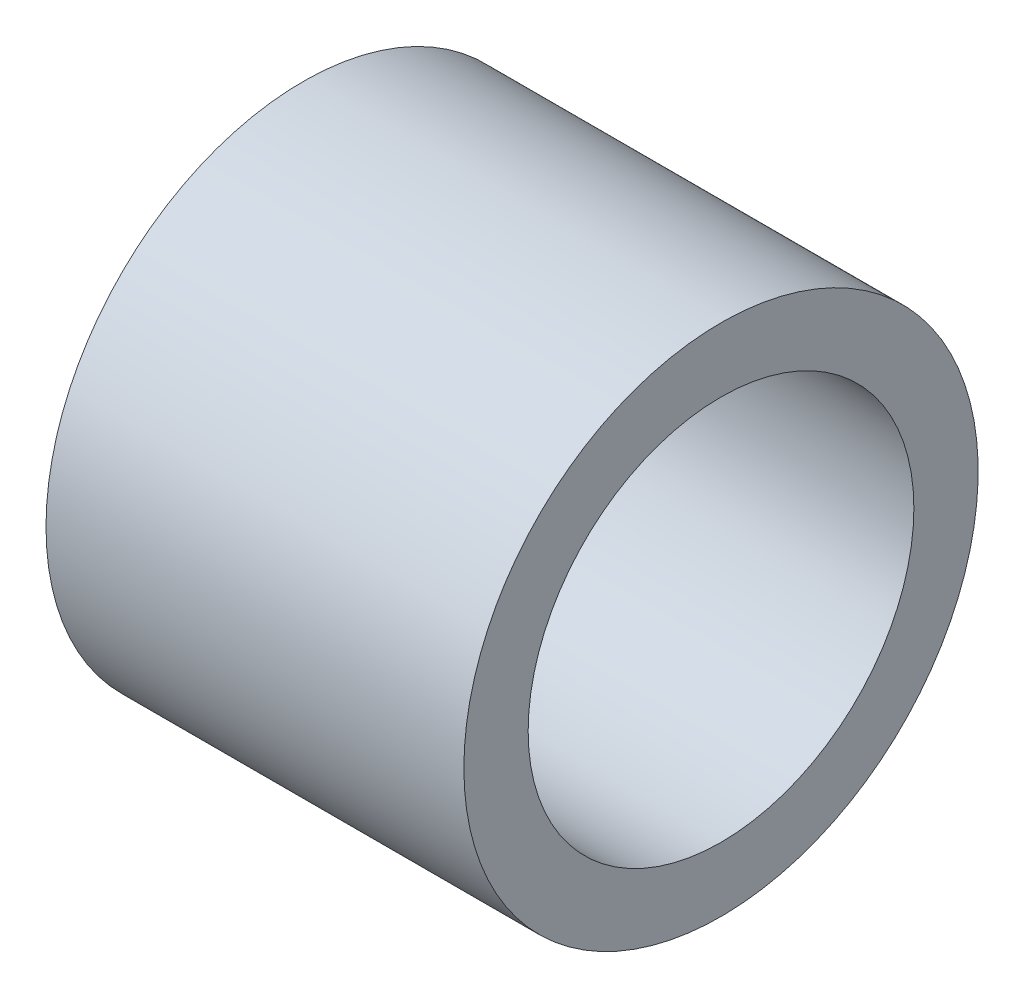
ISO-10303-21;
HEADER;
FILE_DESCRIPTION(('STEP AP214'),'2;1');
FILE_NAME('part.step','',(''),(''),'','','');
FILE_SCHEMA(('AUTOMOTIVE_DESIGN { 1 0 10303 214 1 1 1 1 }'));
ENDSEC;
DATA;
#1=APPLICATION_CONTEXT('core data for automotive mechanical design processes');
#2=APPLICATION_PROTOCOL_DEFINITION('international standard','automotive_design',2000,#1);
#3=PRODUCT_CONTEXT('',#1,'mechanical');
#4=PRODUCT('Part','Part','',(#3));
#5=PRODUCT_RELATED_PRODUCT_CATEGORY('part','',(#4));
#6=PRODUCT_DEFINITION_FORMATION('','',#4);
#7=PRODUCT_DEFINITION_CONTEXT('part definition',#1,'design');
#8=PRODUCT_DEFINITION('design','',#6,#7);
#9=PRODUCT_DEFINITION_SHAPE('','',#8);
#10=(LENGTH_UNIT() NAMED_UNIT(*) SI_UNIT(.MILLI.,.METRE.));
#11=(NAMED_UNIT(*) PLANE_ANGLE_UNIT() SI_UNIT($,.RADIAN.));
#12=(NAMED_UNIT(*) SI_UNIT($,.STERADIAN.) SOLID_ANGLE_UNIT());
#13=UNCERTAINTY_MEASURE_WITH_UNIT(LENGTH_MEASURE(1.E-05),#10,'distance_accuracy_value','');
#14=(GEOMETRIC_REPRESENTATION_CONTEXT(3) GLOBAL_UNCERTAINTY_ASSIGNED_CONTEXT((#13)) GLOBAL_UNIT_ASSIGNED_CONTEXT((#10,
#11,#12)) REPRESENTATION_CONTEXT('',''));
#15=CARTESIAN_POINT('',(0.,0.,0.));
#16=DIRECTION('',(0.,0.,1.));
#17=DIRECTION('',(1.,0.,0.));
#18=AXIS2_PLACEMENT_3D('',#15,#16,#17);
#19=CARTESIAN_POINT('',(0.,3.,0.));
#20=DIRECTION('',(1.,0.,0.));
#21=DIRECTION('',(0.,0.,-1.));
#22=AXIS2_PLACEMENT_3D('',#19,#20,#21);
#23=PLANE('',#22);
#24=CARTESIAN_POINT('',(0.,0.,0.));
#25=DIRECTION('',(-1.,0.,0.));
#26=DIRECTION('',(0.,0.,1.));
#27=AXIS2_PLACEMENT_3D('',#24,#25,#26);
#28=CIRCLE('',#27,3.);
#29=CARTESIAN_POINT('',(0.,0.,3.));
#30=VERTEX_POINT('',#29);
#31=EDGE_CURVE('E55',#30,#30,#28,.T.);
#32=ORIENTED_EDGE('',*,*,#31,.F.);
#33=EDGE_LOOP('',(#32));
#34=FACE_BOUND('',#33,.T.);
#35=CARTESIAN_POINT('',(0.,0.,0.));
#36=DIRECTION('',(-1.,0.,0.));
#37=DIRECTION('',(0.,0.,1.));
#38=AXIS2_PLACEMENT_3D('',#35,#36,#37);
#39=CIRCLE('',#38,4.);
#40=CARTESIAN_POINT('',(0.,0.,4.));
#41=VERTEX_POINT('',#40);
#42=EDGE_CURVE('E10',#41,#41,#39,.T.);
#43=ORIENTED_EDGE('',*,*,#42,.T.);
#44=EDGE_LOOP('',(#43));
#45=FACE_BOUND('',#44,.T.);
#46=ADVANCED_FACE('F37',(#34,#45),#23,.F.);
#47=CARTESIAN_POINT('',(0.,0.,0.));
#48=DIRECTION('',(-1.,0.,0.));
#49=DIRECTION('',(0.,0.,1.));
#50=AXIS2_PLACEMENT_3D('',#47,#48,#49);
#51=CYLINDRICAL_SURFACE('',#50,4.);
#52=ORIENTED_EDGE('',*,*,#42,.F.);
#53=EDGE_LOOP('',(#52));
#54=FACE_BOUND('',#53,.T.);
#55=CARTESIAN_POINT('',(6.5,0.,0.));
#56=DIRECTION('',(-1.,0.,0.));
#57=DIRECTION('',(0.,0.,1.));
#58=AXIS2_PLACEMENT_3D('',#55,#56,#57);
#59=CIRCLE('',#58,4.);
#60=CARTESIAN_POINT('',(6.5,0.,4.));
#61=VERTEX_POINT('',#60);
#62=EDGE_CURVE('E44',#61,#61,#59,.T.);
#63=ORIENTED_EDGE('',*,*,#62,.T.);
#64=EDGE_LOOP('',(#63));
#65=FACE_BOUND('',#64,.T.);
#66=ADVANCED_FACE('F64',(#54,#65),#51,.T.);
#67=CARTESIAN_POINT('',(6.5,3.,0.));
#68=DIRECTION('',(-1.,0.,0.));
#69=DIRECTION('',(0.,0.,1.));
#70=AXIS2_PLACEMENT_3D('',#67,#68,#69);
#71=PLANE('',#70);
#72=ORIENTED_EDGE('',*,*,#62,.F.);
#73=EDGE_LOOP('',(#72));
#74=FACE_BOUND('',#73,.T.);
#75=CARTESIAN_POINT('',(6.5,0.,0.));
#76=DIRECTION('',(-1.,0.,0.));
#77=DIRECTION('',(0.,0.,1.));
#78=AXIS2_PLACEMENT_3D('',#75,#76,#77);
#79=CIRCLE('',#78,3.);
#80=CARTESIAN_POINT('',(6.5,0.,3.));
#81=VERTEX_POINT('',#80);
#82=EDGE_CURVE('E50',#81,#81,#79,.T.);
#83=ORIENTED_EDGE('',*,*,#82,.T.);
#84=EDGE_LOOP('',(#83));
#85=FACE_BOUND('',#84,.T.);
#86=ADVANCED_FACE('F68',(#74,#85),#71,.F.);
#87=CARTESIAN_POINT('',(0.,0.,0.));
#88=DIRECTION('',(-1.,0.,0.));
#89=DIRECTION('',(0.,0.,1.));
#90=AXIS2_PLACEMENT_3D('',#87,#88,#89);
#91=CYLINDRICAL_SURFACE('',#90,3.);
#92=ORIENTED_EDGE('',*,*,#82,.F.);
#93=EDGE_LOOP('',(#92));
#94=FACE_BOUND('',#93,.T.);
#95=ORIENTED_EDGE('',*,*,#31,.T.);
#96=EDGE_LOOP('',(#95));
#97=FACE_BOUND('',#96,.T.);
#98=ADVANCED_FACE('F61',(#94,#97),#91,.F.);
#99=CLOSED_SHELL('',(#46,#66,#86,#98));
#100=MANIFOLD_SOLID_BREP('B2',#99);
#101=ADVANCED_BREP_SHAPE_REPRESENTATION('',(#18,#100),#14);
#102=SHAPE_DEFINITION_REPRESENTATION(#9,#101);
ENDSEC;
END-ISO-10303-21;
